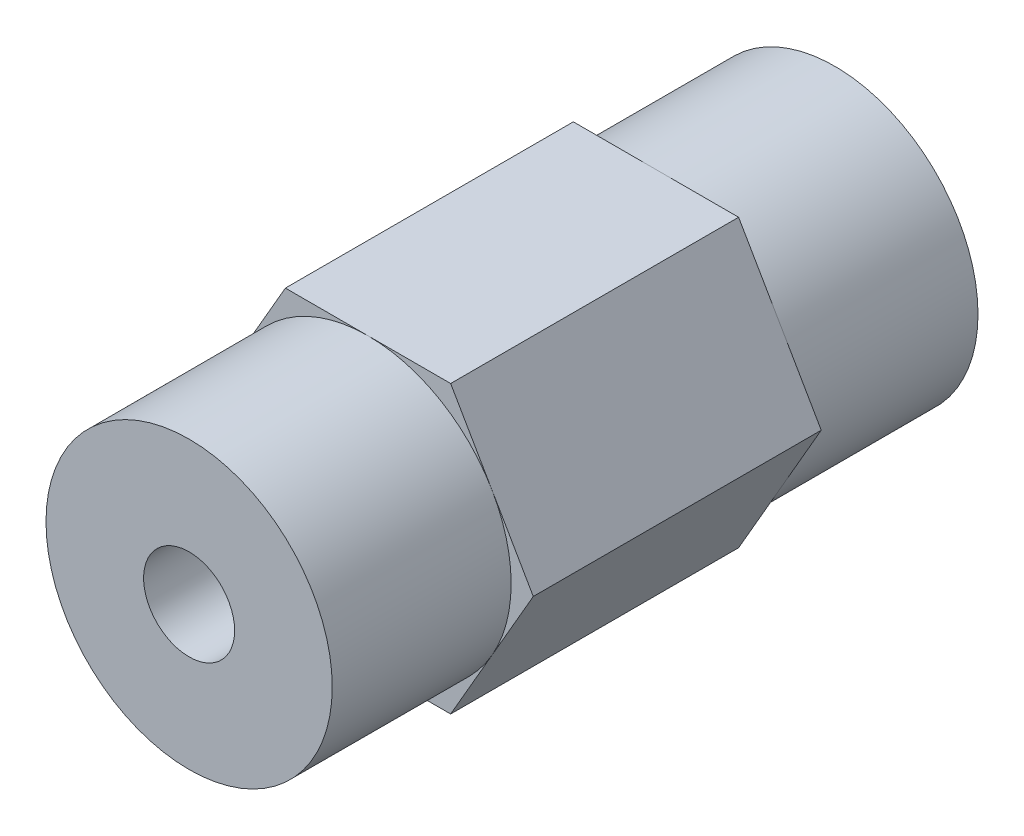
ISO-10303-21;
HEADER;
FILE_DESCRIPTION(('STEP AP214'),'2;1');
FILE_NAME('part.step','',(''),(''),'','','');
FILE_SCHEMA(('AUTOMOTIVE_DESIGN { 1 0 10303 214 1 1 1 1 }'));
ENDSEC;
DATA;
#1=APPLICATION_CONTEXT('core data for automotive mechanical design processes');
#2=APPLICATION_PROTOCOL_DEFINITION('international standard','automotive_design',2000,#1);
#3=PRODUCT_CONTEXT('',#1,'mechanical');
#4=PRODUCT('Part','Part','',(#3));
#5=PRODUCT_RELATED_PRODUCT_CATEGORY('part','',(#4));
#6=PRODUCT_DEFINITION_FORMATION('','',#4);
#7=PRODUCT_DEFINITION_CONTEXT('part definition',#1,'design');
#8=PRODUCT_DEFINITION('design','',#6,#7);
#9=PRODUCT_DEFINITION_SHAPE('','',#8);
#10=(LENGTH_UNIT() NAMED_UNIT(*) SI_UNIT(.MILLI.,.METRE.));
#11=(NAMED_UNIT(*) PLANE_ANGLE_UNIT() SI_UNIT($,.RADIAN.));
#12=(NAMED_UNIT(*) SI_UNIT($,.STERADIAN.) SOLID_ANGLE_UNIT());
#13=UNCERTAINTY_MEASURE_WITH_UNIT(LENGTH_MEASURE(1.E-05),#10,'distance_accuracy_value','');
#14=(GEOMETRIC_REPRESENTATION_CONTEXT(3) GLOBAL_UNCERTAINTY_ASSIGNED_CONTEXT((#13)) GLOBAL_UNIT_ASSIGNED_CONTEXT((#10,
#11,#12)) REPRESENTATION_CONTEXT('',''));
#15=CARTESIAN_POINT('',(0.,0.,0.));
#16=DIRECTION('',(0.,0.,1.));
#17=DIRECTION('',(1.,0.,0.));
#18=AXIS2_PLACEMENT_3D('',#15,#16,#17);
#19=CARTESIAN_POINT('',(0.,0.,-14.3256));
#20=DIRECTION('',(0.,0.,1.));
#21=DIRECTION('',(1.,0.,0.));
#22=AXIS2_PLACEMENT_3D('',#19,#20,#21);
#23=PLANE('',#22);
#24=CARTESIAN_POINT('',(0.,0.,-14.3256));
#25=DIRECTION('',(0.,0.,1.));
#26=DIRECTION('',(1.,0.,0.));
#27=AXIS2_PLACEMENT_3D('',#24,#25,#26);
#28=CIRCLE('',#27,2.0193);
#29=CARTESIAN_POINT('',(2.0193,0.,-14.3256));
#30=VERTEX_POINT('',#29);
#31=EDGE_CURVE('E245',#30,#30,#28,.T.);
#32=ORIENTED_EDGE('',*,*,#31,.T.);
#33=EDGE_LOOP('',(#32));
#34=FACE_BOUND('',#33,.T.);
#35=CARTESIAN_POINT('',(0.,0.,-14.3256));
#36=DIRECTION('',(0.,0.,1.));
#37=DIRECTION('',(1.,0.,0.));
#38=AXIS2_PLACEMENT_3D('',#35,#36,#37);
#39=CIRCLE('',#38,6.35);
#40=CARTESIAN_POINT('',(6.35,0.,-14.3256));
#41=VERTEX_POINT('',#40);
#42=EDGE_CURVE('E276',#41,#41,#39,.F.);
#43=ORIENTED_EDGE('',*,*,#42,.T.);
#44=EDGE_LOOP('',(#43));
#45=FACE_BOUND('',#44,.T.);
#46=ADVANCED_FACE('F70',(#34,#45),#23,.F.);
#47=CARTESIAN_POINT('',(0.,-6.34999999999996,14.3256));
#48=DIRECTION('',(0.,1.,0.));
#49=DIRECTION('',(-1.,0.,0.));
#50=AXIS2_PLACEMENT_3D('',#47,#48,#49);
#51=PLANE('',#50);
#52=DIRECTION('',(0.,0.,-1.));
#53=VECTOR('',#52,1.);
#54=CARTESIAN_POINT('',(-3.66617420935405,-6.35,14.3256));
#55=LINE('',#54,#53);
#56=CARTESIAN_POINT('',(-3.66617420935405,-6.35,6.3881));
#57=VERTEX_POINT('',#56);
#58=CARTESIAN_POINT('',(-3.66617420935405,-6.35,-6.3881));
#59=VERTEX_POINT('',#58);
#60=EDGE_CURVE('E244',#57,#59,#55,.T.);
#61=ORIENTED_EDGE('',*,*,#60,.T.);
#62=DIRECTION('',(1.,0.,0.));
#63=VECTOR('',#62,1.);
#64=CARTESIAN_POINT('',(0.,-6.34999999999996,-6.3881));
#65=LINE('',#64,#63);
#66=CARTESIAN_POINT('',(0.,-6.35,-6.3881));
#67=VERTEX_POINT('',#66);
#68=EDGE_CURVE('E86',#59,#67,#65,.T.);
#69=ORIENTED_EDGE('',*,*,#68,.T.);
#70=CARTESIAN_POINT('',(3.66617420935418,-6.34999999999992,-6.3881));
#71=VERTEX_POINT('',#70);
#72=EDGE_CURVE('E210',#67,#71,#65,.T.);
#73=ORIENTED_EDGE('',*,*,#72,.T.);
#74=DIRECTION('',(0.,0.,-1.));
#75=VECTOR('',#74,1.);
#76=CARTESIAN_POINT('',(3.66617420935418,-6.34999999999992,14.3256));
#77=LINE('',#76,#75);
#78=CARTESIAN_POINT('',(3.66617420935418,-6.34999999999992,6.3881));
#79=VERTEX_POINT('',#78);
#80=EDGE_CURVE('E265',#79,#71,#77,.T.);
#81=ORIENTED_EDGE('',*,*,#80,.F.);
#82=DIRECTION('',(1.,0.,0.));
#83=VECTOR('',#82,1.);
#84=CARTESIAN_POINT('',(0.,-6.34999999999996,6.3881));
#85=LINE('',#84,#83);
#86=CARTESIAN_POINT('',(0.,-6.35,6.3881));
#87=VERTEX_POINT('',#86);
#88=EDGE_CURVE('E236',#87,#79,#85,.T.);
#89=ORIENTED_EDGE('',*,*,#88,.F.);
#90=EDGE_CURVE('E239',#57,#87,#85,.T.);
#91=ORIENTED_EDGE('',*,*,#90,.F.);
#92=EDGE_LOOP('',(#61,#69,#73,#81,#89,#91));
#93=FACE_BOUND('',#92,.T.);
#94=ADVANCED_FACE('F300',(#93),#51,.F.);
#95=CARTESIAN_POINT('',(5.49926131403119,-3.17499999999996,14.3256));
#96=DIRECTION('',(-0.866025403784442,0.499999999999995,0.));
#97=DIRECTION('',(-0.499999999999995,-0.866025403784442,0.));
#98=AXIS2_PLACEMENT_3D('',#95,#96,#97);
#99=PLANE('',#98);
#100=ORIENTED_EDGE('',*,*,#80,.T.);
#101=DIRECTION('',(0.499999999999995,0.866025403784442,0.));
#102=VECTOR('',#101,1.);
#103=CARTESIAN_POINT('',(5.49926131403119,-3.17499999999996,-6.3881));
#104=LINE('',#103,#102);
#105=CARTESIAN_POINT('',(5.4992613140312,-3.17499999999997,-6.3881));
#106=VERTEX_POINT('',#105);
#107=EDGE_CURVE('E204',#71,#106,#104,.T.);
#108=ORIENTED_EDGE('',*,*,#107,.T.);
#109=CARTESIAN_POINT('',(7.33234841870821,0.,-6.3881));
#110=VERTEX_POINT('',#109);
#111=EDGE_CURVE('E182',#106,#110,#104,.T.);
#112=ORIENTED_EDGE('',*,*,#111,.T.);
#113=DIRECTION('',(0.,0.,-1.));
#114=VECTOR('',#113,1.);
#115=CARTESIAN_POINT('',(7.33234841870821,0.,14.3256));
#116=LINE('',#115,#114);
#117=CARTESIAN_POINT('',(7.33234841870821,0.,6.3881));
#118=VERTEX_POINT('',#117);
#119=EDGE_CURVE('E201',#118,#110,#116,.T.);
#120=ORIENTED_EDGE('',*,*,#119,.F.);
#121=DIRECTION('',(0.499999999999995,0.866025403784442,0.));
#122=VECTOR('',#121,1.);
#123=CARTESIAN_POINT('',(5.49926131403119,-3.17499999999996,6.3881));
#124=LINE('',#123,#122);
#125=CARTESIAN_POINT('',(5.4992613140312,-3.17499999999997,6.3881));
#126=VERTEX_POINT('',#125);
#127=EDGE_CURVE('E232',#126,#118,#124,.T.);
#128=ORIENTED_EDGE('',*,*,#127,.F.);
#129=EDGE_CURVE('E235',#79,#126,#124,.T.);
#130=ORIENTED_EDGE('',*,*,#129,.F.);
#131=EDGE_LOOP('',(#100,#108,#112,#120,#128,#130));
#132=FACE_BOUND('',#131,.T.);
#133=ADVANCED_FACE('F319',(#132),#99,.F.);
#134=CARTESIAN_POINT('',(5.49926131403115,3.17499999999999,14.3256));
#135=DIRECTION('',(-0.866025403784438,-0.500000000000001,0.));
#136=DIRECTION('',(0.500000000000001,-0.866025403784438,0.));
#137=AXIS2_PLACEMENT_3D('',#134,#135,#136);
#138=PLANE('',#137);
#139=ORIENTED_EDGE('',*,*,#119,.T.);
#140=DIRECTION('',(-0.500000000000001,0.866025403784438,0.));
#141=VECTOR('',#140,1.);
#142=CARTESIAN_POINT('',(5.49926131403115,3.17499999999999,-6.3881));
#143=LINE('',#142,#141);
#144=CARTESIAN_POINT('',(5.49926131403118,3.17500000000001,-6.3881));
#145=VERTEX_POINT('',#144);
#146=EDGE_CURVE('E175',#110,#145,#143,.T.);
#147=ORIENTED_EDGE('',*,*,#146,.T.);
#148=CARTESIAN_POINT('',(3.66617420935409,6.34999999999998,-6.3881));
#149=VERTEX_POINT('',#148);
#150=EDGE_CURVE('E163',#145,#149,#143,.T.);
#151=ORIENTED_EDGE('',*,*,#150,.T.);
#152=DIRECTION('',(0.,0.,-1.));
#153=VECTOR('',#152,1.);
#154=CARTESIAN_POINT('',(3.66617420935409,6.34999999999998,14.3256));
#155=LINE('',#154,#153);
#156=CARTESIAN_POINT('',(3.66617420935409,6.34999999999998,6.3881));
#157=VERTEX_POINT('',#156);
#158=EDGE_CURVE('E260',#157,#149,#155,.T.);
#159=ORIENTED_EDGE('',*,*,#158,.F.);
#160=DIRECTION('',(-0.500000000000001,0.866025403784438,0.));
#161=VECTOR('',#160,1.);
#162=CARTESIAN_POINT('',(5.49926131403115,3.17499999999999,6.3881));
#163=LINE('',#162,#161);
#164=CARTESIAN_POINT('',(5.49926131403118,3.17500000000001,6.3881));
#165=VERTEX_POINT('',#164);
#166=EDGE_CURVE('E228',#165,#157,#163,.T.);
#167=ORIENTED_EDGE('',*,*,#166,.F.);
#168=EDGE_CURVE('E231',#118,#165,#163,.T.);
#169=ORIENTED_EDGE('',*,*,#168,.F.);
#170=EDGE_LOOP('',(#139,#147,#151,#159,#167,#169));
#171=FACE_BOUND('',#170,.T.);
#172=ADVANCED_FACE('F198',(#171),#138,.F.);
#173=CARTESIAN_POINT('',(0.,6.34999999999996,14.3256));
#174=DIRECTION('',(0.,-1.,0.));
#175=DIRECTION('',(1.,0.,0.));
#176=AXIS2_PLACEMENT_3D('',#173,#174,#175);
#177=PLANE('',#176);
#178=ORIENTED_EDGE('',*,*,#158,.T.);
#179=DIRECTION('',(-1.,0.,0.));
#180=VECTOR('',#179,1.);
#181=CARTESIAN_POINT('',(0.,6.34999999999996,-6.3881));
#182=LINE('',#181,#180);
#183=CARTESIAN_POINT('',(0.,6.35,-6.3881));
#184=VERTEX_POINT('',#183);
#185=EDGE_CURVE('E169',#149,#184,#182,.T.);
#186=ORIENTED_EDGE('',*,*,#185,.T.);
#187=CARTESIAN_POINT('',(-3.66617420935413,6.34999999999995,-6.3881));
#188=VERTEX_POINT('',#187);
#189=EDGE_CURVE('E207',#184,#188,#182,.T.);
#190=ORIENTED_EDGE('',*,*,#189,.T.);
#191=DIRECTION('',(0.,0.,-1.));
#192=VECTOR('',#191,1.);
#193=CARTESIAN_POINT('',(-3.66617420935413,6.34999999999995,14.3256));
#194=LINE('',#193,#192);
#195=CARTESIAN_POINT('',(-3.66617420935413,6.34999999999995,6.3881));
#196=VERTEX_POINT('',#195);
#197=EDGE_CURVE('E256',#196,#188,#194,.T.);
#198=ORIENTED_EDGE('',*,*,#197,.F.);
#199=DIRECTION('',(-1.,0.,0.));
#200=VECTOR('',#199,1.);
#201=CARTESIAN_POINT('',(0.,6.34999999999996,6.3881));
#202=LINE('',#201,#200);
#203=CARTESIAN_POINT('',(0.,6.35,6.3881));
#204=VERTEX_POINT('',#203);
#205=EDGE_CURVE('E224',#204,#196,#202,.T.);
#206=ORIENTED_EDGE('',*,*,#205,.F.);
#207=EDGE_CURVE('E227',#157,#204,#202,.T.);
#208=ORIENTED_EDGE('',*,*,#207,.F.);
#209=EDGE_LOOP('',(#178,#186,#190,#198,#206,#208));
#210=FACE_BOUND('',#209,.T.);
#211=ADVANCED_FACE('F339',(#210),#177,.F.);
#212=CARTESIAN_POINT('',(-5.49926131403117,3.17499999999995,14.3256));
#213=DIRECTION('',(0.866025403784442,-0.499999999999995,0.));
#214=DIRECTION('',(0.499999999999995,0.866025403784442,0.));
#215=AXIS2_PLACEMENT_3D('',#212,#213,#214);
#216=PLANE('',#215);
#217=ORIENTED_EDGE('',*,*,#197,.T.);
#218=DIRECTION('',(-0.499999999999995,-0.866025403784442,0.));
#219=VECTOR('',#218,1.);
#220=CARTESIAN_POINT('',(-5.49926131403117,3.17499999999995,-6.3881));
#221=LINE('',#220,#219);
#222=CARTESIAN_POINT('',(-5.4992613140312,3.17499999999997,-6.3881));
#223=VERTEX_POINT('',#222);
#224=EDGE_CURVE('E330',#188,#223,#221,.T.);
#225=ORIENTED_EDGE('',*,*,#224,.T.);
#226=CARTESIAN_POINT('',(-7.33234841870821,0.,-6.3881));
#227=VERTEX_POINT('',#226);
#228=EDGE_CURVE('E196',#223,#227,#221,.T.);
#229=ORIENTED_EDGE('',*,*,#228,.T.);
#230=DIRECTION('',(0.,0.,-1.));
#231=VECTOR('',#230,1.);
#232=CARTESIAN_POINT('',(-7.33234841870821,0.,14.3256));
#233=LINE('',#232,#231);
#234=CARTESIAN_POINT('',(-7.33234841870821,0.,6.3881));
#235=VERTEX_POINT('',#234);
#236=EDGE_CURVE('E252',#235,#227,#233,.T.);
#237=ORIENTED_EDGE('',*,*,#236,.F.);
#238=DIRECTION('',(-0.499999999999995,-0.866025403784442,0.));
#239=VECTOR('',#238,1.);
#240=CARTESIAN_POINT('',(-5.49926131403117,3.17499999999995,6.3881));
#241=LINE('',#240,#239);
#242=CARTESIAN_POINT('',(-5.4992613140312,3.17499999999997,6.3881));
#243=VERTEX_POINT('',#242);
#244=EDGE_CURVE('E218',#243,#235,#241,.T.);
#245=ORIENTED_EDGE('',*,*,#244,.F.);
#246=EDGE_CURVE('E223',#196,#243,#241,.T.);
#247=ORIENTED_EDGE('',*,*,#246,.F.);
#248=EDGE_LOOP('',(#217,#225,#229,#237,#245,#247));
#249=FACE_BOUND('',#248,.T.);
#250=ADVANCED_FACE('F352',(#249),#216,.F.);
#251=CARTESIAN_POINT('',(-5.49926131403113,-3.17500000000003,14.3256));
#252=DIRECTION('',(0.866025403784434,0.500000000000007,0.));
#253=DIRECTION('',(-0.500000000000007,0.866025403784435,0.));
#254=AXIS2_PLACEMENT_3D('',#251,#252,#253);
#255=PLANE('',#254);
#256=ORIENTED_EDGE('',*,*,#236,.T.);
#257=DIRECTION('',(0.500000000000007,-0.866025403784435,0.));
#258=VECTOR('',#257,1.);
#259=CARTESIAN_POINT('',(-5.49926131403113,-3.17500000000003,-6.3881));
#260=LINE('',#259,#258);
#261=CARTESIAN_POINT('',(-5.49926131403116,-3.17500000000004,-6.3881));
#262=VERTEX_POINT('',#261);
#263=EDGE_CURVE('E12',#227,#262,#260,.T.);
#264=ORIENTED_EDGE('',*,*,#263,.T.);
#265=EDGE_CURVE('E74',#262,#59,#260,.T.);
#266=ORIENTED_EDGE('',*,*,#265,.T.);
#267=ORIENTED_EDGE('',*,*,#60,.F.);
#268=DIRECTION('',(0.500000000000007,-0.866025403784435,0.));
#269=VECTOR('',#268,1.);
#270=CARTESIAN_POINT('',(-5.49926131403113,-3.17500000000003,6.3881));
#271=LINE('',#270,#269);
#272=CARTESIAN_POINT('',(-5.49926131403114,-3.17500000000003,6.3881));
#273=VERTEX_POINT('',#272);
#274=EDGE_CURVE('E273',#273,#57,#271,.T.);
#275=ORIENTED_EDGE('',*,*,#274,.F.);
#276=EDGE_CURVE('E275',#235,#273,#271,.T.);
#277=ORIENTED_EDGE('',*,*,#276,.F.);
#278=EDGE_LOOP('',(#256,#264,#266,#267,#275,#277));
#279=FACE_BOUND('',#278,.T.);
#280=ADVANCED_FACE('F292',(#279),#255,.F.);
#281=CARTESIAN_POINT('',(0.,0.,14.3256));
#282=DIRECTION('',(0.,0.,1.));
#283=DIRECTION('',(1.,0.,0.));
#284=AXIS2_PLACEMENT_3D('',#281,#282,#283);
#285=PLANE('',#284);
#286=CARTESIAN_POINT('',(0.,0.,14.3256));
#287=DIRECTION('',(0.,0.,1.));
#288=DIRECTION('',(1.,0.,0.));
#289=AXIS2_PLACEMENT_3D('',#286,#287,#288);
#290=CIRCLE('',#289,2.0193);
#291=CARTESIAN_POINT('',(2.0193,0.,14.3256));
#292=VERTEX_POINT('',#291);
#293=EDGE_CURVE('E240',#292,#292,#290,.T.);
#294=ORIENTED_EDGE('',*,*,#293,.F.);
#295=EDGE_LOOP('',(#294));
#296=FACE_BOUND('',#295,.T.);
#297=CARTESIAN_POINT('',(0.,0.,14.3256));
#298=DIRECTION('',(0.,0.,1.));
#299=DIRECTION('',(1.,0.,0.));
#300=AXIS2_PLACEMENT_3D('',#297,#298,#299);
#301=CIRCLE('',#300,6.35);
#302=CARTESIAN_POINT('',(6.35,0.,14.3256));
#303=VERTEX_POINT('',#302);
#304=EDGE_CURVE('E269',#303,#303,#301,.T.);
#305=ORIENTED_EDGE('',*,*,#304,.T.);
#306=EDGE_LOOP('',(#305));
#307=FACE_BOUND('',#306,.T.);
#308=ADVANCED_FACE('F378',(#296,#307),#285,.T.);
#309=CARTESIAN_POINT('',(0.,0.,14.3256));
#310=DIRECTION('',(0.,0.,-1.));
#311=DIRECTION('',(-1.,0.,0.));
#312=AXIS2_PLACEMENT_3D('',#309,#310,#311);
#313=CYLINDRICAL_SURFACE('',#312,2.0193);
#314=ORIENTED_EDGE('',*,*,#293,.T.);
#315=EDGE_LOOP('',(#314));
#316=FACE_BOUND('',#315,.T.);
#317=ORIENTED_EDGE('',*,*,#31,.F.);
#318=EDGE_LOOP('',(#317));
#319=FACE_BOUND('',#318,.T.);
#320=ADVANCED_FACE('F72',(#316,#319),#313,.F.);
#321=CARTESIAN_POINT('',(0.,0.,6.3881));
#322=DIRECTION('',(0.,0.,1.));
#323=DIRECTION('',(1.,0.,0.));
#324=AXIS2_PLACEMENT_3D('',#321,#322,#323);
#325=PLANE('',#324);
#326=ORIENTED_EDGE('',*,*,#90,.T.);
#327=CARTESIAN_POINT('',(0.,0.,6.3881));
#328=DIRECTION('',(0.,0.,1.));
#329=DIRECTION('',(1.,0.,0.));
#330=AXIS2_PLACEMENT_3D('',#327,#328,#329);
#331=CIRCLE('',#330,6.35);
#332=EDGE_CURVE('E297',#273,#87,#331,.T.);
#333=ORIENTED_EDGE('',*,*,#332,.F.);
#334=ORIENTED_EDGE('',*,*,#274,.T.);
#335=EDGE_LOOP('',(#326,#333,#334));
#336=FACE_BOUND('',#335,.T.);
#337=ADVANCED_FACE('F295',(#336),#325,.T.);
#338=ORIENTED_EDGE('',*,*,#88,.T.);
#339=ORIENTED_EDGE('',*,*,#129,.T.);
#340=EDGE_CURVE('E311',#87,#126,#331,.T.);
#341=ORIENTED_EDGE('',*,*,#340,.F.);
#342=EDGE_LOOP('',(#338,#339,#341));
#343=FACE_BOUND('',#342,.T.);
#344=ADVANCED_FACE('F497',(#343),#325,.T.);
#345=ORIENTED_EDGE('',*,*,#127,.T.);
#346=ORIENTED_EDGE('',*,*,#168,.T.);
#347=EDGE_CURVE('E220',#126,#165,#331,.T.);
#348=ORIENTED_EDGE('',*,*,#347,.F.);
#349=EDGE_LOOP('',(#345,#346,#348));
#350=FACE_BOUND('',#349,.T.);
#351=ADVANCED_FACE('F490',(#350),#325,.T.);
#352=ORIENTED_EDGE('',*,*,#166,.T.);
#353=ORIENTED_EDGE('',*,*,#207,.T.);
#354=EDGE_CURVE('E214',#165,#204,#331,.T.);
#355=ORIENTED_EDGE('',*,*,#354,.F.);
#356=EDGE_LOOP('',(#352,#353,#355));
#357=FACE_BOUND('',#356,.T.);
#358=ADVANCED_FACE('F345',(#357),#325,.T.);
#359=ORIENTED_EDGE('',*,*,#205,.T.);
#360=ORIENTED_EDGE('',*,*,#246,.T.);
#361=EDGE_CURVE('E219',#204,#243,#331,.T.);
#362=ORIENTED_EDGE('',*,*,#361,.F.);
#363=EDGE_LOOP('',(#359,#360,#362));
#364=FACE_BOUND('',#363,.T.);
#365=ADVANCED_FACE('F351',(#364),#325,.T.);
#366=ORIENTED_EDGE('',*,*,#244,.T.);
#367=ORIENTED_EDGE('',*,*,#276,.T.);
#368=EDGE_CURVE('E94',#243,#273,#331,.T.);
#369=ORIENTED_EDGE('',*,*,#368,.F.);
#370=EDGE_LOOP('',(#366,#367,#369));
#371=FACE_BOUND('',#370,.T.);
#372=ADVANCED_FACE('F287',(#371),#325,.T.);
#373=CARTESIAN_POINT('',(0.,0.,6.3881));
#374=DIRECTION('',(0.,0.,1.));
#375=DIRECTION('',(1.,0.,0.));
#376=AXIS2_PLACEMENT_3D('',#373,#374,#375);
#377=CYLINDRICAL_SURFACE('',#376,6.35);
#378=ORIENTED_EDGE('',*,*,#304,.F.);
#379=EDGE_LOOP('',(#378));
#380=FACE_BOUND('',#379,.T.);
#381=ORIENTED_EDGE('',*,*,#332,.T.);
#382=ORIENTED_EDGE('',*,*,#340,.T.);
#383=ORIENTED_EDGE('',*,*,#347,.T.);
#384=ORIENTED_EDGE('',*,*,#354,.T.);
#385=ORIENTED_EDGE('',*,*,#361,.T.);
#386=ORIENTED_EDGE('',*,*,#368,.T.);
#387=EDGE_LOOP('',(#381,#382,#383,#384,#385,#386));
#388=FACE_BOUND('',#387,.T.);
#389=ADVANCED_FACE('F347',(#380,#388),#377,.T.);
#390=CARTESIAN_POINT('',(0.,0.,-6.3881));
#391=DIRECTION('',(0.,0.,1.));
#392=DIRECTION('',(1.,0.,0.));
#393=AXIS2_PLACEMENT_3D('',#390,#391,#392);
#394=PLANE('',#393);
#395=ORIENTED_EDGE('',*,*,#265,.F.);
#396=CARTESIAN_POINT('',(0.,0.,-6.3881));
#397=DIRECTION('',(0.,0.,1.));
#398=DIRECTION('',(1.,0.,0.));
#399=AXIS2_PLACEMENT_3D('',#396,#397,#398);
#400=CIRCLE('',#399,6.35);
#401=EDGE_CURVE('E325',#262,#67,#400,.T.);
#402=ORIENTED_EDGE('',*,*,#401,.T.);
#403=ORIENTED_EDGE('',*,*,#68,.F.);
#404=EDGE_LOOP('',(#395,#402,#403));
#405=FACE_BOUND('',#404,.T.);
#406=ADVANCED_FACE('F366',(#405),#394,.F.);
#407=EDGE_CURVE('E187',#67,#106,#400,.T.);
#408=ORIENTED_EDGE('',*,*,#407,.T.);
#409=ORIENTED_EDGE('',*,*,#107,.F.);
#410=ORIENTED_EDGE('',*,*,#72,.F.);
#411=EDGE_LOOP('',(#408,#409,#410));
#412=FACE_BOUND('',#411,.T.);
#413=ADVANCED_FACE('F322',(#412),#394,.F.);
#414=EDGE_CURVE('E179',#106,#145,#400,.T.);
#415=ORIENTED_EDGE('',*,*,#414,.T.);
#416=ORIENTED_EDGE('',*,*,#146,.F.);
#417=ORIENTED_EDGE('',*,*,#111,.F.);
#418=EDGE_LOOP('',(#415,#416,#417));
#419=FACE_BOUND('',#418,.T.);
#420=ADVANCED_FACE('F180',(#419),#394,.F.);
#421=EDGE_CURVE('E167',#145,#184,#400,.T.);
#422=ORIENTED_EDGE('',*,*,#421,.T.);
#423=ORIENTED_EDGE('',*,*,#185,.F.);
#424=ORIENTED_EDGE('',*,*,#150,.F.);
#425=EDGE_LOOP('',(#422,#423,#424));
#426=FACE_BOUND('',#425,.T.);
#427=ADVANCED_FACE('F165',(#426),#394,.F.);
#428=EDGE_CURVE('E194',#184,#223,#400,.T.);
#429=ORIENTED_EDGE('',*,*,#428,.T.);
#430=ORIENTED_EDGE('',*,*,#224,.F.);
#431=ORIENTED_EDGE('',*,*,#189,.F.);
#432=EDGE_LOOP('',(#429,#430,#431));
#433=FACE_BOUND('',#432,.T.);
#434=ADVANCED_FACE('F359',(#433),#394,.F.);
#435=EDGE_CURVE('E327',#223,#262,#400,.T.);
#436=ORIENTED_EDGE('',*,*,#435,.T.);
#437=ORIENTED_EDGE('',*,*,#263,.F.);
#438=ORIENTED_EDGE('',*,*,#228,.F.);
#439=EDGE_LOOP('',(#436,#437,#438));
#440=FACE_BOUND('',#439,.T.);
#441=ADVANCED_FACE('F355',(#440),#394,.F.);
#442=CARTESIAN_POINT('',(0.,0.,-6.3881));
#443=DIRECTION('',(0.,0.,-1.));
#444=DIRECTION('',(-1.,0.,0.));
#445=AXIS2_PLACEMENT_3D('',#442,#443,#444);
#446=CYLINDRICAL_SURFACE('',#445,6.35);
#447=ORIENTED_EDGE('',*,*,#407,.F.);
#448=ORIENTED_EDGE('',*,*,#401,.F.);
#449=ORIENTED_EDGE('',*,*,#435,.F.);
#450=ORIENTED_EDGE('',*,*,#428,.F.);
#451=ORIENTED_EDGE('',*,*,#421,.F.);
#452=ORIENTED_EDGE('',*,*,#414,.F.);
#453=EDGE_LOOP('',(#447,#448,#449,#450,#451,#452));
#454=FACE_BOUND('',#453,.T.);
#455=ORIENTED_EDGE('',*,*,#42,.F.);
#456=EDGE_LOOP('',(#455));
#457=FACE_BOUND('',#456,.T.);
#458=ADVANCED_FACE('F190',(#454,#457),#446,.T.);
#459=CLOSED_SHELL('',(#46,#94,#133,#172,#211,#250,#280,#308,#320,#337,#344,#351,#358,#365,#372,
#389,#406,#413,#420,#427,#434,#441,#458));
#460=MANIFOLD_SOLID_BREP('B2',#459);
#461=ADVANCED_BREP_SHAPE_REPRESENTATION('',(#18,#460),#14);
#462=SHAPE_DEFINITION_REPRESENTATION(#9,#461);
ENDSEC;
END-ISO-10303-21;
